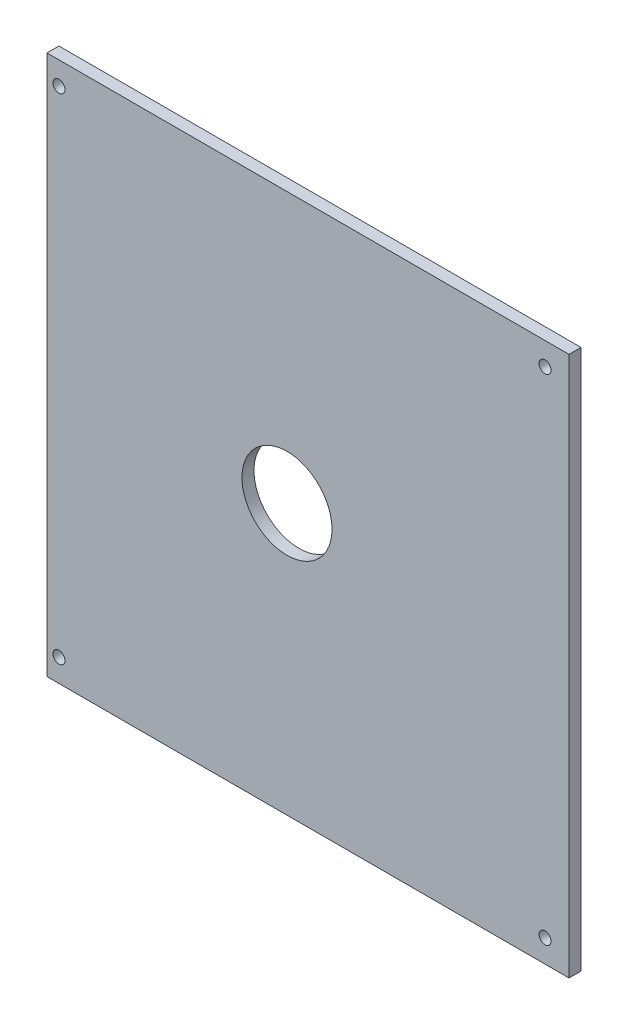
ISO-10303-21;
HEADER;
FILE_DESCRIPTION(('STEP AP214'),'2;1');
FILE_NAME('part.step','',(''),(''),'','','');
FILE_SCHEMA(('AUTOMOTIVE_DESIGN { 1 0 10303 214 1 1 1 1 }'));
ENDSEC;
DATA;
#1=APPLICATION_CONTEXT('core data for automotive mechanical design processes');
#2=APPLICATION_PROTOCOL_DEFINITION('international standard','automotive_design',2000,#1);
#3=PRODUCT_CONTEXT('',#1,'mechanical');
#4=PRODUCT('Part','Part','',(#3));
#5=PRODUCT_RELATED_PRODUCT_CATEGORY('part','',(#4));
#6=PRODUCT_DEFINITION_FORMATION('','',#4);
#7=PRODUCT_DEFINITION_CONTEXT('part definition',#1,'design');
#8=PRODUCT_DEFINITION('design','',#6,#7);
#9=PRODUCT_DEFINITION_SHAPE('','',#8);
#10=(LENGTH_UNIT() NAMED_UNIT(*) SI_UNIT(.MILLI.,.METRE.));
#11=(NAMED_UNIT(*) PLANE_ANGLE_UNIT() SI_UNIT($,.RADIAN.));
#12=(NAMED_UNIT(*) SI_UNIT($,.STERADIAN.) SOLID_ANGLE_UNIT());
#13=UNCERTAINTY_MEASURE_WITH_UNIT(LENGTH_MEASURE(1.E-05),#10,'distance_accuracy_value','');
#14=(GEOMETRIC_REPRESENTATION_CONTEXT(3) GLOBAL_UNCERTAINTY_ASSIGNED_CONTEXT((#13)) GLOBAL_UNIT_ASSIGNED_CONTEXT((#10,
#11,#12)) REPRESENTATION_CONTEXT('',''));
#15=CARTESIAN_POINT('',(0.,0.,0.));
#16=DIRECTION('',(0.,0.,1.));
#17=DIRECTION('',(1.,0.,0.));
#18=AXIS2_PLACEMENT_3D('',#15,#16,#17);
#19=CARTESIAN_POINT('',(0.,0.,2.54));
#20=DIRECTION('',(1.,0.,0.));
#21=DIRECTION('',(0.,1.,0.));
#22=AXIS2_PLACEMENT_3D('',#19,#20,#21);
#23=PLANE('',#22);
#24=DIRECTION('',(0.,-1.,0.));
#25=VECTOR('',#24,1.);
#26=CARTESIAN_POINT('',(0.,0.,0.));
#27=LINE('',#26,#25);
#28=CARTESIAN_POINT('',(0.,0.,0.));
#29=VERTEX_POINT('',#28);
#30=CARTESIAN_POINT('',(0.,-114.3,0.));
#31=VERTEX_POINT('',#30);
#32=EDGE_CURVE('E100',#29,#31,#27,.T.);
#33=ORIENTED_EDGE('',*,*,#32,.T.);
#34=DIRECTION('',(0.,0.,-1.));
#35=VECTOR('',#34,1.);
#36=CARTESIAN_POINT('',(0.,-114.3,2.54));
#37=LINE('',#36,#35);
#38=CARTESIAN_POINT('',(0.,-114.3,2.54));
#39=VERTEX_POINT('',#38);
#40=EDGE_CURVE('E11',#39,#31,#37,.T.);
#41=ORIENTED_EDGE('',*,*,#40,.F.);
#42=DIRECTION('',(0.,-1.,0.));
#43=VECTOR('',#42,1.);
#44=CARTESIAN_POINT('',(0.,0.,2.54));
#45=LINE('',#44,#43);
#46=CARTESIAN_POINT('',(0.,0.,2.54));
#47=VERTEX_POINT('',#46);
#48=EDGE_CURVE('E88',#47,#39,#45,.T.);
#49=ORIENTED_EDGE('',*,*,#48,.F.);
#50=DIRECTION('',(0.,0.,-1.));
#51=VECTOR('',#50,1.);
#52=CARTESIAN_POINT('',(0.,0.,2.54));
#53=LINE('',#52,#51);
#54=EDGE_CURVE('E96',#47,#29,#53,.T.);
#55=ORIENTED_EDGE('',*,*,#54,.T.);
#56=EDGE_LOOP('',(#33,#41,#49,#55));
#57=FACE_BOUND('',#56,.T.);
#58=ADVANCED_FACE('F37',(#57),#23,.F.);
#59=CARTESIAN_POINT('',(0.,-114.3,2.54));
#60=DIRECTION('',(0.,1.,0.));
#61=DIRECTION('',(0.,0.,1.));
#62=AXIS2_PLACEMENT_3D('',#59,#60,#61);
#63=PLANE('',#62);
#64=DIRECTION('',(1.,0.,0.));
#65=VECTOR('',#64,1.);
#66=CARTESIAN_POINT('',(0.,-114.3,0.));
#67=LINE('',#66,#65);
#68=CARTESIAN_POINT('',(110.49,-114.3,0.));
#69=VERTEX_POINT('',#68);
#70=EDGE_CURVE('E92',#31,#69,#67,.T.);
#71=ORIENTED_EDGE('',*,*,#70,.T.);
#72=DIRECTION('',(0.,0.,-1.));
#73=VECTOR('',#72,1.);
#74=CARTESIAN_POINT('',(110.49,-114.3,2.54));
#75=LINE('',#74,#73);
#76=CARTESIAN_POINT('',(110.49,-114.3,2.54));
#77=VERTEX_POINT('',#76);
#78=EDGE_CURVE('E45',#77,#69,#75,.T.);
#79=ORIENTED_EDGE('',*,*,#78,.F.);
#80=DIRECTION('',(1.,0.,0.));
#81=VECTOR('',#80,1.);
#82=CARTESIAN_POINT('',(0.,-114.3,2.54));
#83=LINE('',#82,#81);
#84=EDGE_CURVE('E83',#39,#77,#83,.T.);
#85=ORIENTED_EDGE('',*,*,#84,.F.);
#86=ORIENTED_EDGE('',*,*,#40,.T.);
#87=EDGE_LOOP('',(#71,#79,#85,#86));
#88=FACE_BOUND('',#87,.T.);
#89=ADVANCED_FACE('F91',(#88),#63,.F.);
#90=CARTESIAN_POINT('',(110.49,0.,2.54));
#91=DIRECTION('',(-1.,0.,0.));
#92=DIRECTION('',(0.,-1.,0.));
#93=AXIS2_PLACEMENT_3D('',#90,#91,#92);
#94=PLANE('',#93);
#95=DIRECTION('',(0.,1.,0.));
#96=VECTOR('',#95,1.);
#97=CARTESIAN_POINT('',(110.49,0.,0.));
#98=LINE('',#97,#96);
#99=CARTESIAN_POINT('',(110.49,0.,0.));
#100=VERTEX_POINT('',#99);
#101=EDGE_CURVE('E70',#69,#100,#98,.T.);
#102=ORIENTED_EDGE('',*,*,#101,.T.);
#103=DIRECTION('',(0.,0.,-1.));
#104=VECTOR('',#103,1.);
#105=CARTESIAN_POINT('',(110.49,0.,2.54));
#106=LINE('',#105,#104);
#107=CARTESIAN_POINT('',(110.49,0.,2.54));
#108=VERTEX_POINT('',#107);
#109=EDGE_CURVE('E93',#108,#100,#106,.T.);
#110=ORIENTED_EDGE('',*,*,#109,.F.);
#111=DIRECTION('',(0.,1.,0.));
#112=VECTOR('',#111,1.);
#113=CARTESIAN_POINT('',(110.49,0.,2.54));
#114=LINE('',#113,#112);
#115=EDGE_CURVE('E86',#77,#108,#114,.T.);
#116=ORIENTED_EDGE('',*,*,#115,.F.);
#117=ORIENTED_EDGE('',*,*,#78,.T.);
#118=EDGE_LOOP('',(#102,#110,#116,#117));
#119=FACE_BOUND('',#118,.T.);
#120=ADVANCED_FACE('F94',(#119),#94,.F.);
#121=CARTESIAN_POINT('',(0.,0.,2.54));
#122=DIRECTION('',(0.,-1.,0.));
#123=DIRECTION('',(0.,0.,-1.));
#124=AXIS2_PLACEMENT_3D('',#121,#122,#123);
#125=PLANE('',#124);
#126=DIRECTION('',(-1.,0.,0.));
#127=VECTOR('',#126,1.);
#128=CARTESIAN_POINT('',(0.,0.,0.));
#129=LINE('',#128,#127);
#130=EDGE_CURVE('E76',#100,#29,#129,.T.);
#131=ORIENTED_EDGE('',*,*,#130,.T.);
#132=ORIENTED_EDGE('',*,*,#54,.F.);
#133=DIRECTION('',(-1.,0.,0.));
#134=VECTOR('',#133,1.);
#135=CARTESIAN_POINT('',(0.,0.,2.54));
#136=LINE('',#135,#134);
#137=EDGE_CURVE('E53',#108,#47,#136,.T.);
#138=ORIENTED_EDGE('',*,*,#137,.F.);
#139=ORIENTED_EDGE('',*,*,#109,.T.);
#140=EDGE_LOOP('',(#131,#132,#138,#139));
#141=FACE_BOUND('',#140,.T.);
#142=ADVANCED_FACE('F108',(#141),#125,.F.);
#143=CARTESIAN_POINT('',(0.,0.,2.54));
#144=DIRECTION('',(0.,0.,1.));
#145=DIRECTION('',(1.,0.,0.));
#146=AXIS2_PLACEMENT_3D('',#143,#144,#145);
#147=PLANE('',#146);
#148=CARTESIAN_POINT('',(2.54,-4.826,2.54));
#149=DIRECTION('',(0.,0.,1.));
#150=DIRECTION('',(1.,0.,0.));
#151=AXIS2_PLACEMENT_3D('',#148,#149,#150);
#152=CIRCLE('',#151,1.27);
#153=CARTESIAN_POINT('',(3.81,-4.826,2.54));
#154=VERTEX_POINT('',#153);
#155=EDGE_CURVE('E123',#154,#154,#152,.T.);
#156=ORIENTED_EDGE('',*,*,#155,.F.);
#157=EDGE_LOOP('',(#156));
#158=FACE_BOUND('',#157,.T.);
#159=CARTESIAN_POINT('',(105.41,-109.474,2.54));
#160=DIRECTION('',(0.,0.,1.));
#161=DIRECTION('',(1.,0.,0.));
#162=AXIS2_PLACEMENT_3D('',#159,#160,#161);
#163=CIRCLE('',#162,1.26999999999999);
#164=CARTESIAN_POINT('',(106.68,-109.474,2.54));
#165=VERTEX_POINT('',#164);
#166=EDGE_CURVE('E129',#165,#165,#163,.T.);
#167=ORIENTED_EDGE('',*,*,#166,.F.);
#168=EDGE_LOOP('',(#167));
#169=FACE_BOUND('',#168,.T.);
#170=CARTESIAN_POINT('',(2.54,-109.474,2.54));
#171=DIRECTION('',(0.,0.,1.));
#172=DIRECTION('',(-1.,0.,0.));
#173=AXIS2_PLACEMENT_3D('',#170,#171,#172);
#174=CIRCLE('',#173,1.27);
#175=CARTESIAN_POINT('',(1.27,-109.474,2.54));
#176=VERTEX_POINT('',#175);
#177=EDGE_CURVE('E130',#176,#176,#174,.T.);
#178=ORIENTED_EDGE('',*,*,#177,.F.);
#179=EDGE_LOOP('',(#178));
#180=FACE_BOUND('',#179,.T.);
#181=CARTESIAN_POINT('',(105.41,-4.826,2.54));
#182=DIRECTION('',(0.,0.,1.));
#183=DIRECTION('',(1.,0.,0.));
#184=AXIS2_PLACEMENT_3D('',#181,#182,#183);
#185=CIRCLE('',#184,1.26999999999999);
#186=CARTESIAN_POINT('',(106.68,-4.826,2.54));
#187=VERTEX_POINT('',#186);
#188=EDGE_CURVE('E120',#187,#187,#185,.T.);
#189=ORIENTED_EDGE('',*,*,#188,.F.);
#190=EDGE_LOOP('',(#189));
#191=FACE_BOUND('',#190,.T.);
#192=CARTESIAN_POINT('',(50.8,-57.15,2.54));
#193=DIRECTION('',(0.,0.,1.));
#194=DIRECTION('',(1.,0.,0.));
#195=AXIS2_PLACEMENT_3D('',#192,#193,#194);
#196=CIRCLE('',#195,9.525);
#197=CARTESIAN_POINT('',(60.325,-57.15,2.54));
#198=VERTEX_POINT('',#197);
#199=EDGE_CURVE('E114',#198,#198,#196,.T.);
#200=ORIENTED_EDGE('',*,*,#199,.F.);
#201=EDGE_LOOP('',(#200));
#202=FACE_BOUND('',#201,.T.);
#203=ORIENTED_EDGE('',*,*,#48,.T.);
#204=ORIENTED_EDGE('',*,*,#84,.T.);
#205=ORIENTED_EDGE('',*,*,#115,.T.);
#206=ORIENTED_EDGE('',*,*,#137,.T.);
#207=EDGE_LOOP('',(#203,#204,#205,#206));
#208=FACE_BOUND('',#207,.T.);
#209=ADVANCED_FACE('F84',(#158,#169,#180,#191,#202,#208),#147,.T.);
#210=CARTESIAN_POINT('',(0.,0.,0.));
#211=DIRECTION('',(0.,0.,1.));
#212=DIRECTION('',(1.,0.,0.));
#213=AXIS2_PLACEMENT_3D('',#210,#211,#212);
#214=PLANE('',#213);
#215=CARTESIAN_POINT('',(2.54,-4.826,0.));
#216=DIRECTION('',(0.,0.,1.));
#217=DIRECTION('',(1.,0.,0.));
#218=AXIS2_PLACEMENT_3D('',#215,#216,#217);
#219=CIRCLE('',#218,1.27);
#220=CARTESIAN_POINT('',(3.81,-4.826,0.));
#221=VERTEX_POINT('',#220);
#222=EDGE_CURVE('E133',#221,#221,#219,.T.);
#223=ORIENTED_EDGE('',*,*,#222,.T.);
#224=EDGE_LOOP('',(#223));
#225=FACE_BOUND('',#224,.T.);
#226=CARTESIAN_POINT('',(105.41,-109.474,0.));
#227=DIRECTION('',(0.,0.,1.));
#228=DIRECTION('',(1.,0.,0.));
#229=AXIS2_PLACEMENT_3D('',#226,#227,#228);
#230=CIRCLE('',#229,1.26999999999999);
#231=CARTESIAN_POINT('',(106.68,-109.474,0.));
#232=VERTEX_POINT('',#231);
#233=EDGE_CURVE('E126',#232,#232,#230,.T.);
#234=ORIENTED_EDGE('',*,*,#233,.T.);
#235=EDGE_LOOP('',(#234));
#236=FACE_BOUND('',#235,.T.);
#237=CARTESIAN_POINT('',(2.54,-109.474,0.));
#238=DIRECTION('',(0.,0.,1.));
#239=DIRECTION('',(-1.,0.,0.));
#240=AXIS2_PLACEMENT_3D('',#237,#238,#239);
#241=CIRCLE('',#240,1.27);
#242=CARTESIAN_POINT('',(1.27,-109.474,0.));
#243=VERTEX_POINT('',#242);
#244=EDGE_CURVE('E138',#243,#243,#241,.T.);
#245=ORIENTED_EDGE('',*,*,#244,.T.);
#246=EDGE_LOOP('',(#245));
#247=FACE_BOUND('',#246,.T.);
#248=CARTESIAN_POINT('',(105.41,-4.826,0.));
#249=DIRECTION('',(0.,0.,1.));
#250=DIRECTION('',(1.,0.,0.));
#251=AXIS2_PLACEMENT_3D('',#248,#249,#250);
#252=CIRCLE('',#251,1.26999999999999);
#253=CARTESIAN_POINT('',(106.68,-4.826,0.));
#254=VERTEX_POINT('',#253);
#255=EDGE_CURVE('E117',#254,#254,#252,.T.);
#256=ORIENTED_EDGE('',*,*,#255,.T.);
#257=EDGE_LOOP('',(#256));
#258=FACE_BOUND('',#257,.T.);
#259=CARTESIAN_POINT('',(50.8,-57.15,0.));
#260=DIRECTION('',(0.,0.,1.));
#261=DIRECTION('',(1.,0.,0.));
#262=AXIS2_PLACEMENT_3D('',#259,#260,#261);
#263=CIRCLE('',#262,9.525);
#264=CARTESIAN_POINT('',(60.325,-57.15,0.));
#265=VERTEX_POINT('',#264);
#266=EDGE_CURVE('E103',#265,#265,#263,.T.);
#267=ORIENTED_EDGE('',*,*,#266,.T.);
#268=EDGE_LOOP('',(#267));
#269=FACE_BOUND('',#268,.T.);
#270=ORIENTED_EDGE('',*,*,#32,.F.);
#271=ORIENTED_EDGE('',*,*,#130,.F.);
#272=ORIENTED_EDGE('',*,*,#101,.F.);
#273=ORIENTED_EDGE('',*,*,#70,.F.);
#274=EDGE_LOOP('',(#270,#271,#272,#273));
#275=FACE_BOUND('',#274,.T.);
#276=ADVANCED_FACE('F111',(#225,#236,#247,#258,#269,#275),#214,.F.);
#277=CARTESIAN_POINT('',(50.8,-57.15,0.));
#278=DIRECTION('',(0.,0.,1.));
#279=DIRECTION('',(1.,0.,0.));
#280=AXIS2_PLACEMENT_3D('',#277,#278,#279);
#281=CYLINDRICAL_SURFACE('',#280,9.525);
#282=ORIENTED_EDGE('',*,*,#266,.F.);
#283=EDGE_LOOP('',(#282));
#284=FACE_BOUND('',#283,.T.);
#285=ORIENTED_EDGE('',*,*,#199,.T.);
#286=EDGE_LOOP('',(#285));
#287=FACE_BOUND('',#286,.T.);
#288=ADVANCED_FACE('F154',(#284,#287),#281,.F.);
#289=CARTESIAN_POINT('',(105.41,-4.826,0.));
#290=DIRECTION('',(0.,0.,1.));
#291=DIRECTION('',(1.,0.,0.));
#292=AXIS2_PLACEMENT_3D('',#289,#290,#291);
#293=CYLINDRICAL_SURFACE('',#292,1.26999999999999);
#294=ORIENTED_EDGE('',*,*,#255,.F.);
#295=EDGE_LOOP('',(#294));
#296=FACE_BOUND('',#295,.T.);
#297=ORIENTED_EDGE('',*,*,#188,.T.);
#298=EDGE_LOOP('',(#297));
#299=FACE_BOUND('',#298,.T.);
#300=ADVANCED_FACE('F156',(#296,#299),#293,.F.);
#301=CARTESIAN_POINT('',(2.54,-109.474,0.));
#302=DIRECTION('',(0.,0.,1.));
#303=DIRECTION('',(1.,0.,0.));
#304=AXIS2_PLACEMENT_3D('',#301,#302,#303);
#305=CYLINDRICAL_SURFACE('',#304,1.27);
#306=ORIENTED_EDGE('',*,*,#244,.F.);
#307=EDGE_LOOP('',(#306));
#308=FACE_BOUND('',#307,.T.);
#309=ORIENTED_EDGE('',*,*,#177,.T.);
#310=EDGE_LOOP('',(#309));
#311=FACE_BOUND('',#310,.T.);
#312=ADVANCED_FACE('F144',(#308,#311),#305,.F.);
#313=CARTESIAN_POINT('',(105.41,-109.474,0.));
#314=DIRECTION('',(0.,0.,1.));
#315=DIRECTION('',(1.,0.,0.));
#316=AXIS2_PLACEMENT_3D('',#313,#314,#315);
#317=CYLINDRICAL_SURFACE('',#316,1.26999999999999);
#318=ORIENTED_EDGE('',*,*,#233,.F.);
#319=EDGE_LOOP('',(#318));
#320=FACE_BOUND('',#319,.T.);
#321=ORIENTED_EDGE('',*,*,#166,.T.);
#322=EDGE_LOOP('',(#321));
#323=FACE_BOUND('',#322,.T.);
#324=ADVANCED_FACE('F208',(#320,#323),#317,.F.);
#325=CARTESIAN_POINT('',(2.54,-4.826,0.));
#326=DIRECTION('',(0.,0.,1.));
#327=DIRECTION('',(1.,0.,0.));
#328=AXIS2_PLACEMENT_3D('',#325,#326,#327);
#329=CYLINDRICAL_SURFACE('',#328,1.27);
#330=ORIENTED_EDGE('',*,*,#222,.F.);
#331=EDGE_LOOP('',(#330));
#332=FACE_BOUND('',#331,.T.);
#333=ORIENTED_EDGE('',*,*,#155,.T.);
#334=EDGE_LOOP('',(#333));
#335=FACE_BOUND('',#334,.T.);
#336=ADVANCED_FACE('F219',(#332,#335),#329,.F.);
#337=CLOSED_SHELL('',(#58,#89,#120,#142,#209,#276,#288,#300,#312,#324,#336));
#338=MANIFOLD_SOLID_BREP('B2',#337);
#339=ADVANCED_BREP_SHAPE_REPRESENTATION('',(#18,#338),#14);
#340=SHAPE_DEFINITION_REPRESENTATION(#9,#339);
ENDSEC;
END-ISO-10303-21;
